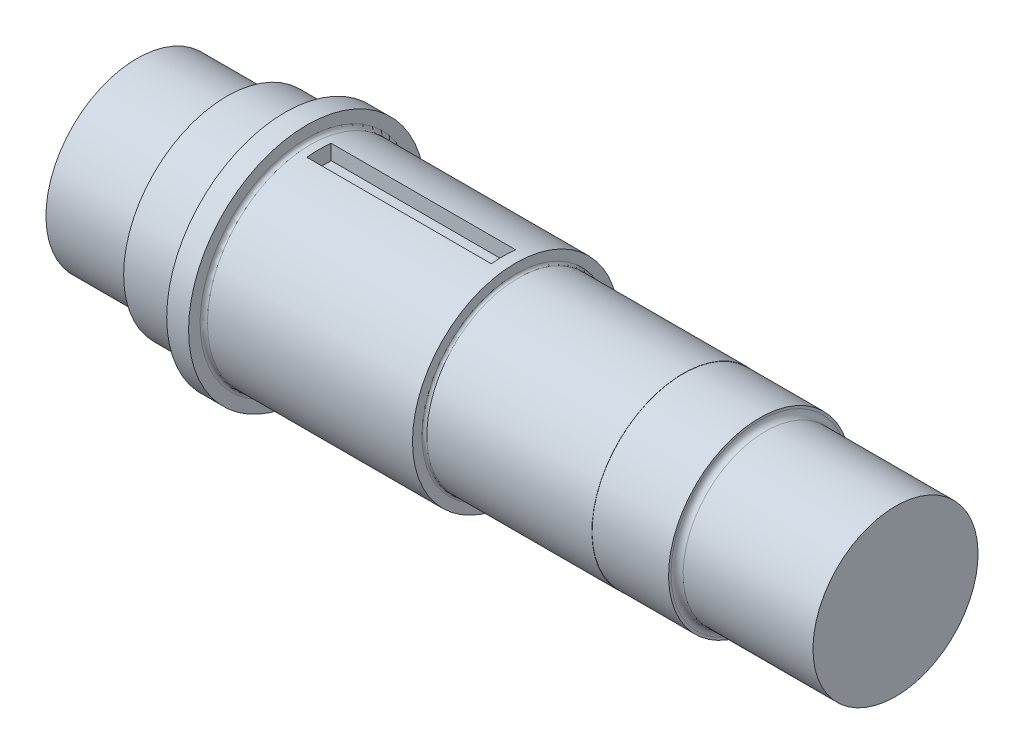
ISO-10303-21;
HEADER;
FILE_DESCRIPTION(('STEP AP214'),'2;1');
FILE_NAME('part.step','',(''),(''),'','','');
FILE_SCHEMA(('AUTOMOTIVE_DESIGN { 1 0 10303 214 1 1 1 1 }'));
ENDSEC;
DATA;
#1=APPLICATION_CONTEXT('core data for automotive mechanical design processes');
#2=APPLICATION_PROTOCOL_DEFINITION('international standard','automotive_design',2000,#1);
#3=PRODUCT_CONTEXT('',#1,'mechanical');
#4=PRODUCT('Part','Part','',(#3));
#5=PRODUCT_RELATED_PRODUCT_CATEGORY('part','',(#4));
#6=PRODUCT_DEFINITION_FORMATION('','',#4);
#7=PRODUCT_DEFINITION_CONTEXT('part definition',#1,'design');
#8=PRODUCT_DEFINITION('design','',#6,#7);
#9=PRODUCT_DEFINITION_SHAPE('','',#8);
#10=(LENGTH_UNIT() NAMED_UNIT(*) SI_UNIT(.MILLI.,.METRE.));
#11=(NAMED_UNIT(*) PLANE_ANGLE_UNIT() SI_UNIT($,.RADIAN.));
#12=(NAMED_UNIT(*) SI_UNIT($,.STERADIAN.) SOLID_ANGLE_UNIT());
#13=UNCERTAINTY_MEASURE_WITH_UNIT(LENGTH_MEASURE(1.E-05),#10,'distance_accuracy_value','');
#14=(GEOMETRIC_REPRESENTATION_CONTEXT(3) GLOBAL_UNCERTAINTY_ASSIGNED_CONTEXT((#13)) GLOBAL_UNIT_ASSIGNED_CONTEXT((#10,
#11,#12)) REPRESENTATION_CONTEXT('',''));
#15=CARTESIAN_POINT('',(0.,0.,0.));
#16=DIRECTION('',(0.,0.,1.));
#17=DIRECTION('',(1.,0.,0.));
#18=AXIS2_PLACEMENT_3D('',#15,#16,#17);
#19=CARTESIAN_POINT('',(-289.147853111058,-40.9474998853553,0.));
#20=DIRECTION('',(-1.,0.,0.));
#21=DIRECTION('',(0.,-1.,0.));
#22=AXIS2_PLACEMENT_3D('',#19,#20,#21);
#23=CYLINDRICAL_SURFACE('',#22,85.);
#24=CARTESIAN_POINT('',(-146.147853111058,-40.9474998853553,0.));
#25=DIRECTION('',(1.,0.,0.));
#26=DIRECTION('',(0.,1.,0.));
#27=AXIS2_PLACEMENT_3D('',#24,#25,#26);
#28=CIRCLE('',#27,85.);
#29=CARTESIAN_POINT('',(-146.147853111058,44.0525001146447,0.));
#30=VERTEX_POINT('',#29);
#31=EDGE_CURVE('E169',#30,#30,#28,.T.);
#32=ORIENTED_EDGE('',*,*,#31,.T.);
#33=EDGE_LOOP('',(#32));
#34=FACE_BOUND('',#33,.T.);
#35=CARTESIAN_POINT('',(22.8521468889415,-40.9474998853553,0.));
#36=DIRECTION('',(-1.,0.,0.));
#37=DIRECTION('',(0.,-1.,0.));
#38=AXIS2_PLACEMENT_3D('',#35,#36,#37);
#39=CIRCLE('',#38,85.);
#40=CARTESIAN_POINT('',(22.8521468889415,-125.947499885355,0.));
#41=VERTEX_POINT('',#40);
#42=EDGE_CURVE('E137',#41,#41,#39,.T.);
#43=ORIENTED_EDGE('',*,*,#42,.T.);
#44=EDGE_LOOP('',(#43));
#45=FACE_BOUND('',#44,.T.);
#46=CARTESIAN_POINT('',(-139.147853111058,-40.9474998853553,0.));
#47=DIRECTION('',(-1.,0.,0.));
#48=DIRECTION('',(0.,0.,1.));
#49=AXIS2_PLACEMENT_3D('',#46,#47,#48);
#50=CIRCLE('',#49,85.);
#51=CARTESIAN_POINT('',(-139.147853111058,43.4622151953153,-10.));
#52=VERTEX_POINT('',#51);
#53=CARTESIAN_POINT('',(-139.147853111058,43.4622151953153,10.));
#54=VERTEX_POINT('',#53);
#55=EDGE_CURVE('E52',#52,#54,#50,.F.);
#56=ORIENTED_EDGE('',*,*,#55,.F.);
#57=DIRECTION('',(-1.,0.,0.));
#58=VECTOR('',#57,1.);
#59=CARTESIAN_POINT('',(-289.147853111058,43.4622151953153,-10.));
#60=LINE('',#59,#58);
#61=CARTESIAN_POINT('',(12.8521468889415,43.4622151953153,-10.));
#62=VERTEX_POINT('',#61);
#63=EDGE_CURVE('E11',#52,#62,#60,.F.);
#64=ORIENTED_EDGE('',*,*,#63,.T.);
#65=CARTESIAN_POINT('',(12.8521468889415,-40.9474998853553,0.));
#66=DIRECTION('',(1.,0.,0.));
#67=DIRECTION('',(0.,1.,0.));
#68=AXIS2_PLACEMENT_3D('',#65,#66,#67);
#69=CIRCLE('',#68,85.);
#70=CARTESIAN_POINT('',(12.8521468889415,43.4622151953153,10.));
#71=VERTEX_POINT('',#70);
#72=EDGE_CURVE('E67',#71,#62,#69,.F.);
#73=ORIENTED_EDGE('',*,*,#72,.F.);
#74=DIRECTION('',(-1.,0.,0.));
#75=VECTOR('',#74,1.);
#76=CARTESIAN_POINT('',(-289.147853111058,43.4622151953153,10.));
#77=LINE('',#76,#75);
#78=EDGE_CURVE('E189',#54,#71,#77,.F.);
#79=ORIENTED_EDGE('',*,*,#78,.F.);
#80=EDGE_LOOP('',(#56,#64,#73,#79));
#81=FACE_BOUND('',#80,.T.);
#82=ADVANCED_FACE('F43',(#34,#45,#81),#23,.T.);
#83=CARTESIAN_POINT('',(-289.147853111058,-40.9474998853553,0.));
#84=DIRECTION('',(-1.,0.,0.));
#85=DIRECTION('',(0.,-1.,0.));
#86=AXIS2_PLACEMENT_3D('',#83,#84,#85);
#87=PLANE('',#86);
#88=CARTESIAN_POINT('',(-289.147853111058,-40.9474998853553,0.));
#89=DIRECTION('',(-1.,0.,0.));
#90=DIRECTION('',(0.,-1.,0.));
#91=AXIS2_PLACEMENT_3D('',#88,#89,#90);
#92=CIRCLE('',#91,75.);
#93=CARTESIAN_POINT('',(-289.147853111058,-115.947499885355,0.));
#94=VERTEX_POINT('',#93);
#95=EDGE_CURVE('E161',#94,#94,#92,.T.);
#96=ORIENTED_EDGE('',*,*,#95,.T.);
#97=EDGE_LOOP('',(#96));
#98=FACE_BOUND('',#97,.T.);
#99=ADVANCED_FACE('F209',(#98),#87,.T.);
#100=CARTESIAN_POINT('',(-289.147853111058,-40.9474998853553,0.));
#101=DIRECTION('',(-1.,0.,0.));
#102=DIRECTION('',(0.,-1.,0.));
#103=AXIS2_PLACEMENT_3D('',#100,#101,#102);
#104=CYLINDRICAL_SURFACE('',#103,75.);
#105=CARTESIAN_POINT('',(-215.147853111058,-40.9474998853553,0.));
#106=DIRECTION('',(-1.,0.,0.));
#107=DIRECTION('',(0.,-1.,0.));
#108=AXIS2_PLACEMENT_3D('',#105,#106,#107);
#109=CIRCLE('',#108,75.);
#110=CARTESIAN_POINT('',(-215.147853111058,-115.947499885355,0.));
#111=VERTEX_POINT('',#110);
#112=EDGE_CURVE('E157',#111,#111,#109,.T.);
#113=ORIENTED_EDGE('',*,*,#112,.T.);
#114=EDGE_LOOP('',(#113));
#115=FACE_BOUND('',#114,.T.);
#116=ORIENTED_EDGE('',*,*,#95,.F.);
#117=EDGE_LOOP('',(#116));
#118=FACE_BOUND('',#117,.T.);
#119=ADVANCED_FACE('F215',(#115,#118),#104,.T.);
#120=CARTESIAN_POINT('',(-215.147853111058,44.0525001146447,0.));
#121=DIRECTION('',(1.,0.,0.));
#122=DIRECTION('',(0.,1.,0.));
#123=AXIS2_PLACEMENT_3D('',#120,#121,#122);
#124=PLANE('',#123);
#125=ORIENTED_EDGE('',*,*,#112,.F.);
#126=EDGE_LOOP('',(#125));
#127=FACE_BOUND('',#126,.T.);
#128=CARTESIAN_POINT('',(-215.147853111058,-40.9474998853553,0.));
#129=DIRECTION('',(-1.,0.,0.));
#130=DIRECTION('',(0.,-1.,0.));
#131=AXIS2_PLACEMENT_3D('',#128,#129,#130);
#132=CIRCLE('',#131,85.);
#133=CARTESIAN_POINT('',(-215.147853111058,-125.947499885355,0.));
#134=VERTEX_POINT('',#133);
#135=EDGE_CURVE('E153',#134,#134,#132,.T.);
#136=ORIENTED_EDGE('',*,*,#135,.T.);
#137=EDGE_LOOP('',(#136));
#138=FACE_BOUND('',#137,.T.);
#139=ADVANCED_FACE('F238',(#127,#138),#124,.F.);
#140=CARTESIAN_POINT('',(-289.147853111058,-40.9474998853553,0.));
#141=DIRECTION('',(-1.,0.,0.));
#142=DIRECTION('',(0.,-1.,0.));
#143=AXIS2_PLACEMENT_3D('',#140,#141,#142);
#144=CYLINDRICAL_SURFACE('',#143,85.);
#145=CARTESIAN_POINT('',(-167.147853111058,-40.9474998853553,0.));
#146=DIRECTION('',(-1.,0.,0.));
#147=DIRECTION('',(0.,-1.,0.));
#148=AXIS2_PLACEMENT_3D('',#145,#146,#147);
#149=CIRCLE('',#148,85.);
#150=CARTESIAN_POINT('',(-167.147853111058,-125.947499885355,0.));
#151=VERTEX_POINT('',#150);
#152=EDGE_CURVE('E149',#151,#151,#149,.T.);
#153=ORIENTED_EDGE('',*,*,#152,.T.);
#154=EDGE_LOOP('',(#153));
#155=FACE_BOUND('',#154,.T.);
#156=ORIENTED_EDGE('',*,*,#135,.F.);
#157=EDGE_LOOP('',(#156));
#158=FACE_BOUND('',#157,.T.);
#159=ADVANCED_FACE('F234',(#155,#158),#144,.T.);
#160=CARTESIAN_POINT('',(-167.147853111058,56.5525001146447,0.));
#161=DIRECTION('',(1.,0.,0.));
#162=DIRECTION('',(0.,1.,0.));
#163=AXIS2_PLACEMENT_3D('',#160,#161,#162);
#164=PLANE('',#163);
#165=ORIENTED_EDGE('',*,*,#152,.F.);
#166=EDGE_LOOP('',(#165));
#167=FACE_BOUND('',#166,.T.);
#168=CARTESIAN_POINT('',(-167.147853111058,-40.9474998853553,0.));
#169=DIRECTION('',(-1.,0.,0.));
#170=DIRECTION('',(0.,-1.,0.));
#171=AXIS2_PLACEMENT_3D('',#168,#169,#170);
#172=CIRCLE('',#171,97.5);
#173=CARTESIAN_POINT('',(-167.147853111058,-138.447499885355,0.));
#174=VERTEX_POINT('',#173);
#175=EDGE_CURVE('E145',#174,#174,#172,.T.);
#176=ORIENTED_EDGE('',*,*,#175,.T.);
#177=EDGE_LOOP('',(#176));
#178=FACE_BOUND('',#177,.T.);
#179=ADVANCED_FACE('F230',(#167,#178),#164,.F.);
#180=CARTESIAN_POINT('',(-289.147853111058,-40.9474998853553,0.));
#181=DIRECTION('',(-1.,0.,0.));
#182=DIRECTION('',(0.,-1.,0.));
#183=AXIS2_PLACEMENT_3D('',#180,#181,#182);
#184=CYLINDRICAL_SURFACE('',#183,97.5);
#185=CARTESIAN_POINT('',(-149.147853111058,-40.9474998853553,0.));
#186=DIRECTION('',(-1.,0.,0.));
#187=DIRECTION('',(0.,-1.,0.));
#188=AXIS2_PLACEMENT_3D('',#185,#186,#187);
#189=CIRCLE('',#188,97.5);
#190=CARTESIAN_POINT('',(-149.147853111058,-138.447499885355,0.));
#191=VERTEX_POINT('',#190);
#192=EDGE_CURVE('E141',#191,#191,#189,.T.);
#193=ORIENTED_EDGE('',*,*,#192,.T.);
#194=EDGE_LOOP('',(#193));
#195=FACE_BOUND('',#194,.T.);
#196=ORIENTED_EDGE('',*,*,#175,.F.);
#197=EDGE_LOOP('',(#196));
#198=FACE_BOUND('',#197,.T.);
#199=ADVANCED_FACE('F226',(#195,#198),#184,.T.);
#200=CARTESIAN_POINT('',(-149.147853111058,56.5525001146447,0.));
#201=DIRECTION('',(1.,0.,0.));
#202=DIRECTION('',(0.,1.,0.));
#203=AXIS2_PLACEMENT_3D('',#200,#201,#202);
#204=PLANE('',#203);
#205=CARTESIAN_POINT('',(-149.147853111058,-40.9474998853553,0.));
#206=DIRECTION('',(1.,0.,0.));
#207=DIRECTION('',(0.,1.,0.));
#208=AXIS2_PLACEMENT_3D('',#205,#206,#207);
#209=CIRCLE('',#208,88.);
#210=CARTESIAN_POINT('',(-149.147853111058,47.0525001146447,0.));
#211=VERTEX_POINT('',#210);
#212=EDGE_CURVE('E165',#211,#211,#209,.F.);
#213=ORIENTED_EDGE('',*,*,#212,.T.);
#214=EDGE_LOOP('',(#213));
#215=FACE_BOUND('',#214,.T.);
#216=ORIENTED_EDGE('',*,*,#192,.F.);
#217=EDGE_LOOP('',(#216));
#218=FACE_BOUND('',#217,.T.);
#219=ADVANCED_FACE('F223',(#215,#218),#204,.T.);
#220=CARTESIAN_POINT('',(22.8521468889415,44.0525001146447,0.));
#221=DIRECTION('',(1.,0.,0.));
#222=DIRECTION('',(0.,1.,0.));
#223=AXIS2_PLACEMENT_3D('',#220,#221,#222);
#224=PLANE('',#223);
#225=CARTESIAN_POINT('',(22.8521468889415,-40.9474998853553,0.));
#226=DIRECTION('',(1.,0.,0.));
#227=DIRECTION('',(0.,1.,0.));
#228=AXIS2_PLACEMENT_3D('',#225,#226,#227);
#229=CIRCLE('',#228,77.2);
#230=CARTESIAN_POINT('',(22.8521468889415,36.2525001146447,0.));
#231=VERTEX_POINT('',#230);
#232=EDGE_CURVE('E173',#231,#231,#229,.F.);
#233=ORIENTED_EDGE('',*,*,#232,.T.);
#234=EDGE_LOOP('',(#233));
#235=FACE_BOUND('',#234,.T.);
#236=ORIENTED_EDGE('',*,*,#42,.F.);
#237=EDGE_LOOP('',(#236));
#238=FACE_BOUND('',#237,.T.);
#239=ADVANCED_FACE('F221',(#235,#238),#224,.T.);
#240=CARTESIAN_POINT('',(-289.147853111058,-40.9474998853553,0.));
#241=DIRECTION('',(-1.,0.,0.));
#242=DIRECTION('',(0.,-1.,0.));
#243=AXIS2_PLACEMENT_3D('',#240,#241,#242);
#244=CYLINDRICAL_SURFACE('',#243,75.2);
#245=CARTESIAN_POINT('',(24.8521468889415,-40.9474998853553,0.));
#246=DIRECTION('',(1.,0.,0.));
#247=DIRECTION('',(0.,1.,0.));
#248=AXIS2_PLACEMENT_3D('',#245,#246,#247);
#249=CIRCLE('',#248,75.2);
#250=CARTESIAN_POINT('',(24.8521468889415,34.2525001146447,0.));
#251=VERTEX_POINT('',#250);
#252=EDGE_CURVE('E177',#251,#251,#249,.T.);
#253=ORIENTED_EDGE('',*,*,#252,.T.);
#254=EDGE_LOOP('',(#253));
#255=FACE_BOUND('',#254,.T.);
#256=CARTESIAN_POINT('',(160.852146888942,-40.9474998853553,0.));
#257=DIRECTION('',(-1.,0.,0.));
#258=DIRECTION('',(0.,-1.,0.));
#259=AXIS2_PLACEMENT_3D('',#256,#257,#258);
#260=CIRCLE('',#259,75.2);
#261=CARTESIAN_POINT('',(160.852146888942,-116.147499885355,0.));
#262=VERTEX_POINT('',#261);
#263=EDGE_CURVE('E133',#262,#262,#260,.T.);
#264=ORIENTED_EDGE('',*,*,#263,.T.);
#265=EDGE_LOOP('',(#264));
#266=FACE_BOUND('',#265,.T.);
#267=ADVANCED_FACE('F263',(#255,#266),#244,.T.);
#268=CARTESIAN_POINT('',(160.852146888942,34.0525001146447,0.));
#269=DIRECTION('',(-1.,0.,0.));
#270=DIRECTION('',(0.,-1.,0.));
#271=AXIS2_PLACEMENT_3D('',#268,#269,#270);
#272=PLANE('',#271);
#273=ORIENTED_EDGE('',*,*,#263,.F.);
#274=EDGE_LOOP('',(#273));
#275=FACE_BOUND('',#274,.T.);
#276=CARTESIAN_POINT('',(160.852146888942,-40.9474998853553,0.));
#277=DIRECTION('',(-1.,0.,0.));
#278=DIRECTION('',(0.,-1.,0.));
#279=AXIS2_PLACEMENT_3D('',#276,#277,#278);
#280=CIRCLE('',#279,75.);
#281=CARTESIAN_POINT('',(160.852146888942,-115.947499885355,0.));
#282=VERTEX_POINT('',#281);
#283=EDGE_CURVE('E129',#282,#282,#280,.T.);
#284=ORIENTED_EDGE('',*,*,#283,.T.);
#285=EDGE_LOOP('',(#284));
#286=FACE_BOUND('',#285,.T.);
#287=ADVANCED_FACE('F268',(#275,#286),#272,.F.);
#288=CARTESIAN_POINT('',(-289.147853111058,-40.9474998853553,0.));
#289=DIRECTION('',(-1.,0.,0.));
#290=DIRECTION('',(0.,-1.,0.));
#291=AXIS2_PLACEMENT_3D('',#288,#289,#290);
#292=CYLINDRICAL_SURFACE('',#291,75.);
#293=CARTESIAN_POINT('',(223.852146888942,-40.9474998853553,0.));
#294=DIRECTION('',(-1.,0.,0.));
#295=DIRECTION('',(0.,-1.,0.));
#296=AXIS2_PLACEMENT_3D('',#293,#294,#295);
#297=CIRCLE('',#296,75.);
#298=CARTESIAN_POINT('',(223.852146888942,-115.947499885355,0.));
#299=VERTEX_POINT('',#298);
#300=EDGE_CURVE('E125',#299,#299,#297,.T.);
#301=ORIENTED_EDGE('',*,*,#300,.T.);
#302=EDGE_LOOP('',(#301));
#303=FACE_BOUND('',#302,.T.);
#304=ORIENTED_EDGE('',*,*,#283,.F.);
#305=EDGE_LOOP('',(#304));
#306=FACE_BOUND('',#305,.T.);
#307=ADVANCED_FACE('F273',(#303,#306),#292,.T.);
#308=CARTESIAN_POINT('',(223.852146888942,27.0525001146447,0.));
#309=DIRECTION('',(-1.,0.,0.));
#310=DIRECTION('',(0.,-1.,0.));
#311=AXIS2_PLACEMENT_3D('',#308,#309,#310);
#312=PLANE('',#311);
#313=CARTESIAN_POINT('',(223.852146888942,-40.9474998853553,0.));
#314=DIRECTION('',(-1.,0.,0.));
#315=DIRECTION('',(0.,-1.,0.));
#316=AXIS2_PLACEMENT_3D('',#313,#314,#315);
#317=CIRCLE('',#316,73.);
#318=CARTESIAN_POINT('',(223.852146888942,-113.947499885355,0.));
#319=VERTEX_POINT('',#318);
#320=EDGE_CURVE('E181',#319,#319,#317,.T.);
#321=ORIENTED_EDGE('',*,*,#320,.T.);
#322=EDGE_LOOP('',(#321));
#323=FACE_BOUND('',#322,.T.);
#324=ORIENTED_EDGE('',*,*,#300,.F.);
#325=EDGE_LOOP('',(#324));
#326=FACE_BOUND('',#325,.T.);
#327=ADVANCED_FACE('F280',(#323,#326),#312,.F.);
#328=CARTESIAN_POINT('',(-289.147853111058,-40.9474998853553,0.));
#329=DIRECTION('',(-1.,0.,0.));
#330=DIRECTION('',(0.,-1.,0.));
#331=AXIS2_PLACEMENT_3D('',#328,#329,#330);
#332=CYLINDRICAL_SURFACE('',#331,68.);
#333=CARTESIAN_POINT('',(228.852146888942,-40.9474998853553,0.));
#334=DIRECTION('',(-1.,0.,0.));
#335=DIRECTION('',(0.,-1.,0.));
#336=AXIS2_PLACEMENT_3D('',#333,#334,#335);
#337=CIRCLE('',#336,68.);
#338=CARTESIAN_POINT('',(228.852146888942,-108.947499885355,0.));
#339=VERTEX_POINT('',#338);
#340=EDGE_CURVE('E185',#339,#339,#337,.F.);
#341=ORIENTED_EDGE('',*,*,#340,.T.);
#342=EDGE_LOOP('',(#341));
#343=FACE_BOUND('',#342,.T.);
#344=CARTESIAN_POINT('',(335.852146888942,-40.9474998853553,0.));
#345=DIRECTION('',(-1.,0.,0.));
#346=DIRECTION('',(0.,-1.,0.));
#347=AXIS2_PLACEMENT_3D('',#344,#345,#346);
#348=CIRCLE('',#347,68.);
#349=CARTESIAN_POINT('',(335.852146888942,-108.947499885355,0.));
#350=VERTEX_POINT('',#349);
#351=EDGE_CURVE('E120',#350,#350,#348,.T.);
#352=ORIENTED_EDGE('',*,*,#351,.T.);
#353=EDGE_LOOP('',(#352));
#354=FACE_BOUND('',#353,.T.);
#355=ADVANCED_FACE('F284',(#343,#354),#332,.T.);
#356=CARTESIAN_POINT('',(335.852146888942,27.0525001146447,0.));
#357=DIRECTION('',(1.,0.,0.));
#358=DIRECTION('',(0.,1.,0.));
#359=AXIS2_PLACEMENT_3D('',#356,#357,#358);
#360=PLANE('',#359);
#361=ORIENTED_EDGE('',*,*,#351,.F.);
#362=EDGE_LOOP('',(#361));
#363=FACE_BOUND('',#362,.T.);
#364=ADVANCED_FACE('F249',(#363),#360,.T.);
#365=CARTESIAN_POINT('',(-146.147853111058,-40.9474998853553,0.));
#366=DIRECTION('',(1.,0.,0.));
#367=DIRECTION('',(0.,1.,0.));
#368=AXIS2_PLACEMENT_3D('',#365,#366,#367);
#369=TOROIDAL_SURFACE('',#368,88.,3.);
#370=ORIENTED_EDGE('',*,*,#31,.F.);
#371=EDGE_LOOP('',(#370));
#372=FACE_BOUND('',#371,.T.);
#373=ORIENTED_EDGE('',*,*,#212,.F.);
#374=EDGE_LOOP('',(#373));
#375=FACE_BOUND('',#374,.T.);
#376=ADVANCED_FACE('F246',(#372,#375),#369,.F.);
#377=CARTESIAN_POINT('',(24.8521468889415,-40.9474998853553,0.));
#378=DIRECTION('',(1.,0.,0.));
#379=DIRECTION('',(0.,1.,0.));
#380=AXIS2_PLACEMENT_3D('',#377,#378,#379);
#381=TOROIDAL_SURFACE('',#380,77.2,2.);
#382=ORIENTED_EDGE('',*,*,#252,.F.);
#383=EDGE_LOOP('',(#382));
#384=FACE_BOUND('',#383,.T.);
#385=ORIENTED_EDGE('',*,*,#232,.F.);
#386=EDGE_LOOP('',(#385));
#387=FACE_BOUND('',#386,.T.);
#388=ADVANCED_FACE('F248',(#384,#387),#381,.F.);
#389=CARTESIAN_POINT('',(228.852146888942,-40.9474998853553,0.));
#390=DIRECTION('',(-1.,0.,0.));
#391=DIRECTION('',(0.,-1.,0.));
#392=AXIS2_PLACEMENT_3D('',#389,#390,#391);
#393=TOROIDAL_SURFACE('',#392,73.,5.);
#394=ORIENTED_EDGE('',*,*,#340,.F.);
#395=EDGE_LOOP('',(#394));
#396=FACE_BOUND('',#395,.T.);
#397=ORIENTED_EDGE('',*,*,#320,.F.);
#398=EDGE_LOOP('',(#397));
#399=FACE_BOUND('',#398,.T.);
#400=ADVANCED_FACE('F45',(#396,#399),#393,.F.);
#401=CARTESIAN_POINT('',(-139.147853111058,44.0525001146447,-10.));
#402=DIRECTION('',(-1.,0.,0.));
#403=DIRECTION('',(0.,0.,1.));
#404=AXIS2_PLACEMENT_3D('',#401,#402,#403);
#405=PLANE('',#404);
#406=DIRECTION('',(0.,-1.,0.));
#407=VECTOR('',#406,1.);
#408=CARTESIAN_POINT('',(-139.147853111058,44.0525001146447,-10.));
#409=LINE('',#408,#407);
#410=CARTESIAN_POINT('',(-139.147853111058,31.0525001146447,-10.));
#411=VERTEX_POINT('',#410);
#412=EDGE_CURVE('E88',#52,#411,#409,.T.);
#413=ORIENTED_EDGE('',*,*,#412,.F.);
#414=ORIENTED_EDGE('',*,*,#55,.T.);
#415=DIRECTION('',(0.,-1.,0.));
#416=VECTOR('',#415,1.);
#417=CARTESIAN_POINT('',(-139.147853111058,44.0525001146447,10.));
#418=LINE('',#417,#416);
#419=CARTESIAN_POINT('',(-139.147853111058,31.0525001146447,10.));
#420=VERTEX_POINT('',#419);
#421=EDGE_CURVE('E59',#54,#420,#418,.T.);
#422=ORIENTED_EDGE('',*,*,#421,.T.);
#423=DIRECTION('',(0.,0.,1.));
#424=VECTOR('',#423,1.);
#425=CARTESIAN_POINT('',(-139.147853111058,31.0525001146447,-10.));
#426=LINE('',#425,#424);
#427=EDGE_CURVE('E98',#411,#420,#426,.T.);
#428=ORIENTED_EDGE('',*,*,#427,.F.);
#429=EDGE_LOOP('',(#413,#414,#422,#428));
#430=FACE_BOUND('',#429,.T.);
#431=ADVANCED_FACE('F99',(#430),#405,.F.);
#432=CARTESIAN_POINT('',(12.8521468889415,44.0525001146447,-10.));
#433=DIRECTION('',(1.,0.,0.));
#434=DIRECTION('',(0.,1.,0.));
#435=AXIS2_PLACEMENT_3D('',#432,#433,#434);
#436=PLANE('',#435);
#437=ORIENTED_EDGE('',*,*,#72,.T.);
#438=DIRECTION('',(0.,1.,0.));
#439=VECTOR('',#438,1.);
#440=CARTESIAN_POINT('',(12.8521468889415,44.0525001146447,-10.));
#441=LINE('',#440,#439);
#442=CARTESIAN_POINT('',(12.8521468889415,31.0525001146447,-10.));
#443=VERTEX_POINT('',#442);
#444=EDGE_CURVE('E104',#443,#62,#441,.T.);
#445=ORIENTED_EDGE('',*,*,#444,.F.);
#446=DIRECTION('',(0.,0.,1.));
#447=VECTOR('',#446,1.);
#448=CARTESIAN_POINT('',(12.8521468889415,31.0525001146447,-10.));
#449=LINE('',#448,#447);
#450=CARTESIAN_POINT('',(12.8521468889415,31.0525001146447,10.));
#451=VERTEX_POINT('',#450);
#452=EDGE_CURVE('E103',#443,#451,#449,.T.);
#453=ORIENTED_EDGE('',*,*,#452,.T.);
#454=DIRECTION('',(0.,1.,0.));
#455=VECTOR('',#454,1.);
#456=CARTESIAN_POINT('',(12.8521468889415,44.0525001146447,10.));
#457=LINE('',#456,#455);
#458=EDGE_CURVE('E95',#451,#71,#457,.T.);
#459=ORIENTED_EDGE('',*,*,#458,.T.);
#460=EDGE_LOOP('',(#437,#445,#453,#459));
#461=FACE_BOUND('',#460,.T.);
#462=ADVANCED_FACE('F198',(#461),#436,.F.);
#463=CARTESIAN_POINT('',(-139.147853111058,31.0525001146447,-10.));
#464=DIRECTION('',(0.,-1.,0.));
#465=DIRECTION('',(0.,0.,-1.));
#466=AXIS2_PLACEMENT_3D('',#463,#464,#465);
#467=PLANE('',#466);
#468=DIRECTION('',(1.,0.,0.));
#469=VECTOR('',#468,1.);
#470=CARTESIAN_POINT('',(-139.147853111058,31.0525001146447,10.));
#471=LINE('',#470,#469);
#472=EDGE_CURVE('E114',#420,#451,#471,.T.);
#473=ORIENTED_EDGE('',*,*,#472,.T.);
#474=ORIENTED_EDGE('',*,*,#452,.F.);
#475=DIRECTION('',(1.,0.,0.));
#476=VECTOR('',#475,1.);
#477=CARTESIAN_POINT('',(-139.147853111058,31.0525001146447,-10.));
#478=LINE('',#477,#476);
#479=EDGE_CURVE('E92',#411,#443,#478,.T.);
#480=ORIENTED_EDGE('',*,*,#479,.F.);
#481=ORIENTED_EDGE('',*,*,#427,.T.);
#482=EDGE_LOOP('',(#473,#474,#480,#481));
#483=FACE_BOUND('',#482,.T.);
#484=ADVANCED_FACE('F106',(#483),#467,.F.);
#485=CARTESIAN_POINT('',(0.,0.,-10.));
#486=DIRECTION('',(0.,0.,1.));
#487=DIRECTION('',(1.,0.,0.));
#488=AXIS2_PLACEMENT_3D('',#485,#486,#487);
#489=PLANE('',#488);
#490=ORIENTED_EDGE('',*,*,#412,.T.);
#491=ORIENTED_EDGE('',*,*,#479,.T.);
#492=ORIENTED_EDGE('',*,*,#444,.T.);
#493=ORIENTED_EDGE('',*,*,#63,.F.);
#494=EDGE_LOOP('',(#490,#491,#492,#493));
#495=FACE_BOUND('',#494,.T.);
#496=ADVANCED_FACE('F90',(#495),#489,.T.);
#497=CARTESIAN_POINT('',(0.,0.,10.));
#498=DIRECTION('',(0.,0.,1.));
#499=DIRECTION('',(1.,0.,0.));
#500=AXIS2_PLACEMENT_3D('',#497,#498,#499);
#501=PLANE('',#500);
#502=ORIENTED_EDGE('',*,*,#78,.T.);
#503=ORIENTED_EDGE('',*,*,#458,.F.);
#504=ORIENTED_EDGE('',*,*,#472,.F.);
#505=ORIENTED_EDGE('',*,*,#421,.F.);
#506=EDGE_LOOP('',(#502,#503,#504,#505));
#507=FACE_BOUND('',#506,.T.);
#508=ADVANCED_FACE('F197',(#507),#501,.F.);
#509=CLOSED_SHELL('',(#82,#99,#119,#139,#159,#179,#199,#219,#239,#267,#287,#307,#327,#355,#364,
#376,#388,#400,#431,#462,#484,#496,#508));
#510=MANIFOLD_SOLID_BREP('B2',#509);
#511=ADVANCED_BREP_SHAPE_REPRESENTATION('',(#18,#510),#14);
#512=SHAPE_DEFINITION_REPRESENTATION(#9,#511);
ENDSEC;
END-ISO-10303-21;
